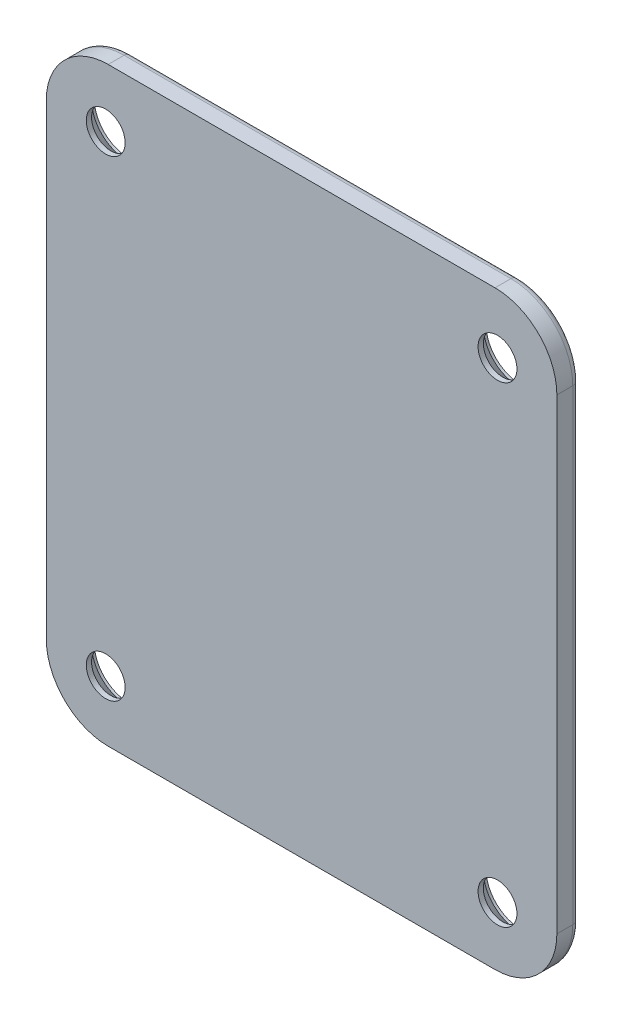
ISO-10303-21;
HEADER;
FILE_DESCRIPTION(('STEP AP214'),'2;1');
FILE_NAME('part.step','',(''),(''),'','','');
FILE_SCHEMA(('AUTOMOTIVE_DESIGN { 1 0 10303 214 1 1 1 1 }'));
ENDSEC;
DATA;
#1=APPLICATION_CONTEXT('core data for automotive mechanical design processes');
#2=APPLICATION_PROTOCOL_DEFINITION('international standard','automotive_design',2000,#1);
#3=PRODUCT_CONTEXT('',#1,'mechanical');
#4=PRODUCT('Part','Part','',(#3));
#5=PRODUCT_RELATED_PRODUCT_CATEGORY('part','',(#4));
#6=PRODUCT_DEFINITION_FORMATION('','',#4);
#7=PRODUCT_DEFINITION_CONTEXT('part definition',#1,'design');
#8=PRODUCT_DEFINITION('design','',#6,#7);
#9=PRODUCT_DEFINITION_SHAPE('','',#8);
#10=(LENGTH_UNIT() NAMED_UNIT(*) SI_UNIT(.MILLI.,.METRE.));
#11=(NAMED_UNIT(*) PLANE_ANGLE_UNIT() SI_UNIT($,.RADIAN.));
#12=(NAMED_UNIT(*) SI_UNIT($,.STERADIAN.) SOLID_ANGLE_UNIT());
#13=UNCERTAINTY_MEASURE_WITH_UNIT(LENGTH_MEASURE(1.E-05),#10,'distance_accuracy_value','');
#14=(GEOMETRIC_REPRESENTATION_CONTEXT(3) GLOBAL_UNCERTAINTY_ASSIGNED_CONTEXT((#13)) GLOBAL_UNIT_ASSIGNED_CONTEXT((#10,
#11,#12)) REPRESENTATION_CONTEXT('',''));
#15=CARTESIAN_POINT('',(0.,0.,0.));
#16=DIRECTION('',(0.,0.,1.));
#17=DIRECTION('',(1.,0.,0.));
#18=AXIS2_PLACEMENT_3D('',#15,#16,#17);
#19=CARTESIAN_POINT('',(11.085,13.345,0.15));
#20=DIRECTION('',(0.,0.,-1.));
#21=DIRECTION('',(1.,0.,0.));
#22=AXIS2_PLACEMENT_3D('',#19,#20,#21);
#23=CONICAL_SURFACE('',#22,1.95,0.785398163397);
#24=DIRECTION('',(-0.707106781186547,0.,0.707106781186547));
#25=VECTOR('',#24,1.);
#26=CARTESIAN_POINT('',(12.61,13.345,0.575));
#27=LINE('',#26,#25);
#28=CARTESIAN_POINT('',(13.035,13.345,0.15));
#29=VERTEX_POINT('',#28);
#30=CARTESIAN_POINT('',(12.185,13.345,1.));
#31=VERTEX_POINT('',#30);
#32=EDGE_CURVE('E9',#29,#31,#27,.T.);
#33=ORIENTED_EDGE('',*,*,#32,.T.);
#34=CARTESIAN_POINT('',(11.085,13.345,1.));
#35=DIRECTION('',(0.,0.,1.));
#36=DIRECTION('',(1.,0.,0.));
#37=AXIS2_PLACEMENT_3D('',#34,#35,#36);
#38=CIRCLE('',#37,1.1);
#39=EDGE_CURVE('E324',#31,#31,#38,.T.);
#40=ORIENTED_EDGE('',*,*,#39,.T.);
#41=ORIENTED_EDGE('',*,*,#32,.F.);
#42=CARTESIAN_POINT('',(11.085,13.345,0.15));
#43=DIRECTION('',(0.,0.,1.));
#44=DIRECTION('',(1.,0.,0.));
#45=AXIS2_PLACEMENT_3D('',#42,#43,#44);
#46=CIRCLE('',#45,1.95);
#47=EDGE_CURVE('E257',#29,#29,#46,.T.);
#48=ORIENTED_EDGE('',*,*,#47,.F.);
#49=EDGE_LOOP('',(#33,#40,#41,#48));
#50=FACE_BOUND('',#49,.T.);
#51=ADVANCED_FACE('F15',(#50),#23,.F.);
#52=CARTESIAN_POINT('',(-11.085,13.345,0.15));
#53=DIRECTION('',(0.,0.,-1.));
#54=DIRECTION('',(1.,0.,0.));
#55=AXIS2_PLACEMENT_3D('',#52,#53,#54);
#56=CONICAL_SURFACE('',#55,1.95,0.785398163397);
#57=DIRECTION('',(-0.707106781186547,0.,0.707106781186547));
#58=VECTOR('',#57,1.);
#59=CARTESIAN_POINT('',(-9.56,13.345,0.575));
#60=LINE('',#59,#58);
#61=CARTESIAN_POINT('',(-9.135,13.345,0.15));
#62=VERTEX_POINT('',#61);
#63=CARTESIAN_POINT('',(-9.985,13.345,1.));
#64=VERTEX_POINT('',#63);
#65=EDGE_CURVE('E26',#62,#64,#60,.T.);
#66=ORIENTED_EDGE('',*,*,#65,.T.);
#67=CARTESIAN_POINT('',(-11.085,13.345,1.));
#68=DIRECTION('',(0.,0.,1.));
#69=DIRECTION('',(1.,0.,0.));
#70=AXIS2_PLACEMENT_3D('',#67,#68,#69);
#71=CIRCLE('',#70,1.1);
#72=EDGE_CURVE('E273',#64,#64,#71,.T.);
#73=ORIENTED_EDGE('',*,*,#72,.T.);
#74=ORIENTED_EDGE('',*,*,#65,.F.);
#75=CARTESIAN_POINT('',(-11.085,13.345,0.15));
#76=DIRECTION('',(0.,0.,1.));
#77=DIRECTION('',(1.,0.,0.));
#78=AXIS2_PLACEMENT_3D('',#75,#76,#77);
#79=CIRCLE('',#78,1.95);
#80=EDGE_CURVE('E258',#62,#62,#79,.T.);
#81=ORIENTED_EDGE('',*,*,#80,.F.);
#82=EDGE_LOOP('',(#66,#73,#74,#81));
#83=FACE_BOUND('',#82,.T.);
#84=ADVANCED_FACE('F499',(#83),#56,.F.);
#85=CARTESIAN_POINT('',(11.085,-13.345,0.15));
#86=DIRECTION('',(0.,0.,-1.));
#87=DIRECTION('',(1.,0.,0.));
#88=AXIS2_PLACEMENT_3D('',#85,#86,#87);
#89=CONICAL_SURFACE('',#88,1.95,0.785398163397);
#90=DIRECTION('',(-0.707106781186547,0.,0.707106781186547));
#91=VECTOR('',#90,1.);
#92=CARTESIAN_POINT('',(12.61,-13.345,0.575));
#93=LINE('',#92,#91);
#94=CARTESIAN_POINT('',(13.035,-13.345,0.15));
#95=VERTEX_POINT('',#94);
#96=CARTESIAN_POINT('',(12.185,-13.345,1.));
#97=VERTEX_POINT('',#96);
#98=EDGE_CURVE('E340',#95,#97,#93,.T.);
#99=ORIENTED_EDGE('',*,*,#98,.T.);
#100=CARTESIAN_POINT('',(11.085,-13.345,1.));
#101=DIRECTION('',(0.,0.,1.));
#102=DIRECTION('',(1.,0.,0.));
#103=AXIS2_PLACEMENT_3D('',#100,#101,#102);
#104=CIRCLE('',#103,1.1);
#105=EDGE_CURVE('E274',#97,#97,#104,.T.);
#106=ORIENTED_EDGE('',*,*,#105,.T.);
#107=ORIENTED_EDGE('',*,*,#98,.F.);
#108=CARTESIAN_POINT('',(11.085,-13.345,0.15));
#109=DIRECTION('',(0.,0.,1.));
#110=DIRECTION('',(1.,0.,0.));
#111=AXIS2_PLACEMENT_3D('',#108,#109,#110);
#112=CIRCLE('',#111,1.95);
#113=EDGE_CURVE('E318',#95,#95,#112,.T.);
#114=ORIENTED_EDGE('',*,*,#113,.F.);
#115=EDGE_LOOP('',(#99,#106,#107,#114));
#116=FACE_BOUND('',#115,.T.);
#117=ADVANCED_FACE('F504',(#116),#89,.F.);
#118=CARTESIAN_POINT('',(-11.085,-13.345,0.15));
#119=DIRECTION('',(0.,0.,-1.));
#120=DIRECTION('',(1.,0.,0.));
#121=AXIS2_PLACEMENT_3D('',#118,#119,#120);
#122=CONICAL_SURFACE('',#121,1.95,0.785398163397);
#123=DIRECTION('',(-0.707106781186547,0.,0.707106781186547));
#124=VECTOR('',#123,1.);
#125=CARTESIAN_POINT('',(-9.56,-13.345,0.575));
#126=LINE('',#125,#124);
#127=CARTESIAN_POINT('',(-9.135,-13.345,0.15));
#128=VERTEX_POINT('',#127);
#129=CARTESIAN_POINT('',(-9.985,-13.345,1.));
#130=VERTEX_POINT('',#129);
#131=EDGE_CURVE('E19',#128,#130,#126,.T.);
#132=ORIENTED_EDGE('',*,*,#131,.T.);
#133=CARTESIAN_POINT('',(-11.085,-13.345,1.));
#134=DIRECTION('',(0.,0.,1.));
#135=DIRECTION('',(1.,0.,0.));
#136=AXIS2_PLACEMENT_3D('',#133,#134,#135);
#137=CIRCLE('',#136,1.1);
#138=EDGE_CURVE('E333',#130,#130,#137,.T.);
#139=ORIENTED_EDGE('',*,*,#138,.T.);
#140=ORIENTED_EDGE('',*,*,#131,.F.);
#141=CARTESIAN_POINT('',(-11.085,-13.345,0.15));
#142=DIRECTION('',(0.,0.,1.));
#143=DIRECTION('',(1.,0.,0.));
#144=AXIS2_PLACEMENT_3D('',#141,#142,#143);
#145=CIRCLE('',#144,1.95);
#146=EDGE_CURVE('E332',#128,#128,#145,.T.);
#147=ORIENTED_EDGE('',*,*,#146,.F.);
#148=EDGE_LOOP('',(#132,#139,#140,#147));
#149=FACE_BOUND('',#148,.T.);
#150=ADVANCED_FACE('F577',(#149),#122,.F.);
#151=CARTESIAN_POINT('',(11.085,13.345,0.));
#152=DIRECTION('',(0.,0.,-1.));
#153=DIRECTION('',(1.,0.,0.));
#154=AXIS2_PLACEMENT_3D('',#151,#152,#153);
#155=CYLINDRICAL_SURFACE('',#154,1.95);
#156=DIRECTION('',(0.,0.,1.));
#157=VECTOR('',#156,1.);
#158=CARTESIAN_POINT('',(13.035,13.345,0.));
#159=LINE('',#158,#157);
#160=CARTESIAN_POINT('',(13.035,13.345,0.));
#161=VERTEX_POINT('',#160);
#162=EDGE_CURVE('E253',#161,#29,#159,.T.);
#163=ORIENTED_EDGE('',*,*,#162,.T.);
#164=ORIENTED_EDGE('',*,*,#47,.T.);
#165=ORIENTED_EDGE('',*,*,#162,.F.);
#166=CARTESIAN_POINT('',(11.085,13.345,0.));
#167=DIRECTION('',(0.,0.,1.));
#168=DIRECTION('',(1.,0.,0.));
#169=AXIS2_PLACEMENT_3D('',#166,#167,#168);
#170=CIRCLE('',#169,1.95);
#171=EDGE_CURVE('E302',#161,#161,#170,.T.);
#172=ORIENTED_EDGE('',*,*,#171,.F.);
#173=EDGE_LOOP('',(#163,#164,#165,#172));
#174=FACE_BOUND('',#173,.T.);
#175=ADVANCED_FACE('F584',(#174),#155,.F.);
#176=CARTESIAN_POINT('',(-11.085,13.345,0.));
#177=DIRECTION('',(0.,0.,-1.));
#178=DIRECTION('',(1.,0.,0.));
#179=AXIS2_PLACEMENT_3D('',#176,#177,#178);
#180=CYLINDRICAL_SURFACE('',#179,1.95);
#181=DIRECTION('',(0.,0.,1.));
#182=VECTOR('',#181,1.);
#183=CARTESIAN_POINT('',(-9.135,13.345,0.));
#184=LINE('',#183,#182);
#185=CARTESIAN_POINT('',(-9.135,13.345,0.));
#186=VERTEX_POINT('',#185);
#187=EDGE_CURVE('E322',#186,#62,#184,.T.);
#188=ORIENTED_EDGE('',*,*,#187,.T.);
#189=ORIENTED_EDGE('',*,*,#80,.T.);
#190=ORIENTED_EDGE('',*,*,#187,.F.);
#191=CARTESIAN_POINT('',(-11.085,13.345,0.));
#192=DIRECTION('',(0.,0.,1.));
#193=DIRECTION('',(1.,0.,0.));
#194=AXIS2_PLACEMENT_3D('',#191,#192,#193);
#195=CIRCLE('',#194,1.95);
#196=EDGE_CURVE('E298',#186,#186,#195,.T.);
#197=ORIENTED_EDGE('',*,*,#196,.F.);
#198=EDGE_LOOP('',(#188,#189,#190,#197));
#199=FACE_BOUND('',#198,.T.);
#200=ADVANCED_FACE('F580',(#199),#180,.F.);
#201=CARTESIAN_POINT('',(11.085,-13.345,0.));
#202=DIRECTION('',(0.,0.,-1.));
#203=DIRECTION('',(1.,0.,0.));
#204=AXIS2_PLACEMENT_3D('',#201,#202,#203);
#205=CYLINDRICAL_SURFACE('',#204,1.95);
#206=DIRECTION('',(0.,0.,1.));
#207=VECTOR('',#206,1.);
#208=CARTESIAN_POINT('',(13.035,-13.345,0.));
#209=LINE('',#208,#207);
#210=CARTESIAN_POINT('',(13.035,-13.345,0.));
#211=VERTEX_POINT('',#210);
#212=EDGE_CURVE('E323',#211,#95,#209,.T.);
#213=ORIENTED_EDGE('',*,*,#212,.T.);
#214=ORIENTED_EDGE('',*,*,#113,.T.);
#215=ORIENTED_EDGE('',*,*,#212,.F.);
#216=CARTESIAN_POINT('',(11.085,-13.345,0.));
#217=DIRECTION('',(0.,0.,1.));
#218=DIRECTION('',(1.,0.,0.));
#219=AXIS2_PLACEMENT_3D('',#216,#217,#218);
#220=CIRCLE('',#219,1.95);
#221=EDGE_CURVE('E284',#211,#211,#220,.T.);
#222=ORIENTED_EDGE('',*,*,#221,.F.);
#223=EDGE_LOOP('',(#213,#214,#215,#222));
#224=FACE_BOUND('',#223,.T.);
#225=ADVANCED_FACE('F583',(#224),#205,.F.);
#226=CARTESIAN_POINT('',(-11.085,-13.345,0.));
#227=DIRECTION('',(0.,0.,-1.));
#228=DIRECTION('',(1.,0.,0.));
#229=AXIS2_PLACEMENT_3D('',#226,#227,#228);
#230=CYLINDRICAL_SURFACE('',#229,1.95);
#231=DIRECTION('',(0.,0.,1.));
#232=VECTOR('',#231,1.);
#233=CARTESIAN_POINT('',(-9.135,-13.345,0.));
#234=LINE('',#233,#232);
#235=CARTESIAN_POINT('',(-9.135,-13.345,0.));
#236=VERTEX_POINT('',#235);
#237=EDGE_CURVE('E248',#236,#128,#234,.T.);
#238=ORIENTED_EDGE('',*,*,#237,.T.);
#239=ORIENTED_EDGE('',*,*,#146,.T.);
#240=ORIENTED_EDGE('',*,*,#237,.F.);
#241=CARTESIAN_POINT('',(-11.085,-13.345,0.));
#242=DIRECTION('',(0.,0.,1.));
#243=DIRECTION('',(1.,0.,0.));
#244=AXIS2_PLACEMENT_3D('',#241,#242,#243);
#245=CIRCLE('',#244,1.95);
#246=EDGE_CURVE('E280',#236,#236,#245,.T.);
#247=ORIENTED_EDGE('',*,*,#246,.F.);
#248=EDGE_LOOP('',(#238,#239,#240,#247));
#249=FACE_BOUND('',#248,.T.);
#250=ADVANCED_FACE('F479',(#249),#230,.F.);
#251=CARTESIAN_POINT('',(14.045,13.205,0.4));
#252=DIRECTION('',(0.,-1.,0.));
#253=DIRECTION('',(1.,0.,0.));
#254=AXIS2_PLACEMENT_3D('',#251,#252,#253);
#255=CYLINDRICAL_SURFACE('',#254,0.4);
#256=DIRECTION('',(0.,-1.,0.));
#257=VECTOR('',#256,1.);
#258=CARTESIAN_POINT('',(14.445,13.205,0.4));
#259=LINE('',#258,#257);
#260=CARTESIAN_POINT('',(14.445,13.205,0.4));
#261=VERTEX_POINT('',#260);
#262=CARTESIAN_POINT('',(14.445,-13.205,0.4));
#263=VERTEX_POINT('',#262);
#264=EDGE_CURVE('E337',#261,#263,#259,.T.);
#265=ORIENTED_EDGE('',*,*,#264,.T.);
#266=CARTESIAN_POINT('',(14.045,-13.205,0.4));
#267=DIRECTION('',(0.,1.,0.));
#268=DIRECTION('',(1.,0.,0.));
#269=AXIS2_PLACEMENT_3D('',#266,#267,#268);
#270=CIRCLE('',#269,0.4);
#271=CARTESIAN_POINT('',(14.045,-13.205,0.));
#272=VERTEX_POINT('',#271);
#273=EDGE_CURVE('E278',#263,#272,#270,.T.);
#274=ORIENTED_EDGE('',*,*,#273,.T.);
#275=DIRECTION('',(0.,-1.,0.));
#276=VECTOR('',#275,1.);
#277=CARTESIAN_POINT('',(14.045,13.205,0.));
#278=LINE('',#277,#276);
#279=CARTESIAN_POINT('',(14.045,13.205,0.));
#280=VERTEX_POINT('',#279);
#281=EDGE_CURVE('E382',#280,#272,#278,.T.);
#282=ORIENTED_EDGE('',*,*,#281,.F.);
#283=CARTESIAN_POINT('',(14.045,13.205,0.4));
#284=DIRECTION('',(0.,1.,0.));
#285=DIRECTION('',(1.,0.,0.));
#286=AXIS2_PLACEMENT_3D('',#283,#284,#285);
#287=CIRCLE('',#286,0.4);
#288=EDGE_CURVE('E310',#261,#280,#287,.T.);
#289=ORIENTED_EDGE('',*,*,#288,.F.);
#290=EDGE_LOOP('',(#265,#274,#282,#289));
#291=FACE_BOUND('',#290,.T.);
#292=ADVANCED_FACE('F594',(#291),#255,.T.);
#293=CARTESIAN_POINT('',(10.945,13.205,0.4));
#294=DIRECTION('',(0.,0.,-1.));
#295=DIRECTION('',(0.,1.,0.));
#296=AXIS2_PLACEMENT_3D('',#293,#294,#295);
#297=TOROIDAL_SURFACE('',#296,3.1,0.4);
#298=CARTESIAN_POINT('',(10.945,16.305,0.4));
#299=DIRECTION('',(-1.,0.,0.));
#300=DIRECTION('',(0.,1.,0.));
#301=AXIS2_PLACEMENT_3D('',#298,#299,#300);
#302=CIRCLE('',#301,0.4);
#303=CARTESIAN_POINT('',(10.945,16.705,0.4));
#304=VERTEX_POINT('',#303);
#305=CARTESIAN_POINT('',(10.945,16.305,0.));
#306=VERTEX_POINT('',#305);
#307=EDGE_CURVE('E275',#304,#306,#302,.T.);
#308=ORIENTED_EDGE('',*,*,#307,.F.);
#309=CARTESIAN_POINT('',(10.945,13.205,0.4));
#310=DIRECTION('',(0.,0.,-1.));
#311=DIRECTION('',(0.,1.,0.));
#312=AXIS2_PLACEMENT_3D('',#309,#310,#311);
#313=CIRCLE('',#312,3.5);
#314=EDGE_CURVE('E306',#304,#261,#313,.T.);
#315=ORIENTED_EDGE('',*,*,#314,.T.);
#316=ORIENTED_EDGE('',*,*,#288,.T.);
#317=CARTESIAN_POINT('',(10.945,13.205,0.));
#318=DIRECTION('',(0.,0.,-1.));
#319=DIRECTION('',(0.,1.,0.));
#320=AXIS2_PLACEMENT_3D('',#317,#318,#319);
#321=CIRCLE('',#320,3.1);
#322=EDGE_CURVE('E378',#306,#280,#321,.T.);
#323=ORIENTED_EDGE('',*,*,#322,.F.);
#324=EDGE_LOOP('',(#308,#315,#316,#323));
#325=FACE_BOUND('',#324,.T.);
#326=ADVANCED_FACE('F597',(#325),#297,.T.);
#327=CARTESIAN_POINT('',(10.945,-13.205,0.4));
#328=DIRECTION('',(0.,0.,-1.));
#329=DIRECTION('',(1.,0.,0.));
#330=AXIS2_PLACEMENT_3D('',#327,#328,#329);
#331=TOROIDAL_SURFACE('',#330,3.1,0.4);
#332=ORIENTED_EDGE('',*,*,#273,.F.);
#333=CARTESIAN_POINT('',(10.945,-13.205,0.4));
#334=DIRECTION('',(0.,0.,-1.));
#335=DIRECTION('',(1.,0.,0.));
#336=AXIS2_PLACEMENT_3D('',#333,#334,#335);
#337=CIRCLE('',#336,3.5);
#338=CARTESIAN_POINT('',(10.945,-16.705,0.4));
#339=VERTEX_POINT('',#338);
#340=EDGE_CURVE('E401',#263,#339,#337,.T.);
#341=ORIENTED_EDGE('',*,*,#340,.T.);
#342=CARTESIAN_POINT('',(10.945,-16.305,0.4));
#343=DIRECTION('',(1.,0.,0.));
#344=DIRECTION('',(0.,-1.,0.));
#345=AXIS2_PLACEMENT_3D('',#342,#343,#344);
#346=CIRCLE('',#345,0.4);
#347=CARTESIAN_POINT('',(10.945,-16.305,0.));
#348=VERTEX_POINT('',#347);
#349=EDGE_CURVE('E279',#339,#348,#346,.T.);
#350=ORIENTED_EDGE('',*,*,#349,.T.);
#351=CARTESIAN_POINT('',(10.945,-13.205,0.));
#352=DIRECTION('',(0.,0.,-1.));
#353=DIRECTION('',(1.,0.,0.));
#354=AXIS2_PLACEMENT_3D('',#351,#352,#353);
#355=CIRCLE('',#354,3.1);
#356=EDGE_CURVE('E379',#272,#348,#355,.T.);
#357=ORIENTED_EDGE('',*,*,#356,.F.);
#358=EDGE_LOOP('',(#332,#341,#350,#357));
#359=FACE_BOUND('',#358,.T.);
#360=ADVANCED_FACE('F599',(#359),#331,.T.);
#361=CARTESIAN_POINT('',(-10.945,16.305,0.4));
#362=DIRECTION('',(1.,0.,0.));
#363=DIRECTION('',(0.,1.,0.));
#364=AXIS2_PLACEMENT_3D('',#361,#362,#363);
#365=CYLINDRICAL_SURFACE('',#364,0.4);
#366=DIRECTION('',(1.,0.,0.));
#367=VECTOR('',#366,1.);
#368=CARTESIAN_POINT('',(-10.945,16.705,0.4));
#369=LINE('',#368,#367);
#370=CARTESIAN_POINT('',(-10.945,16.705,0.4));
#371=VERTEX_POINT('',#370);
#372=EDGE_CURVE('E367',#371,#304,#369,.T.);
#373=ORIENTED_EDGE('',*,*,#372,.T.);
#374=ORIENTED_EDGE('',*,*,#307,.T.);
#375=DIRECTION('',(1.,0.,0.));
#376=VECTOR('',#375,1.);
#377=CARTESIAN_POINT('',(-10.945,16.305,0.));
#378=LINE('',#377,#376);
#379=CARTESIAN_POINT('',(-10.945,16.305,0.));
#380=VERTEX_POINT('',#379);
#381=EDGE_CURVE('E223',#380,#306,#378,.T.);
#382=ORIENTED_EDGE('',*,*,#381,.F.);
#383=CARTESIAN_POINT('',(-10.945,16.305,0.4));
#384=DIRECTION('',(-1.,0.,0.));
#385=DIRECTION('',(0.,1.,0.));
#386=AXIS2_PLACEMENT_3D('',#383,#384,#385);
#387=CIRCLE('',#386,0.4);
#388=EDGE_CURVE('E218',#371,#380,#387,.T.);
#389=ORIENTED_EDGE('',*,*,#388,.F.);
#390=EDGE_LOOP('',(#373,#374,#382,#389));
#391=FACE_BOUND('',#390,.T.);
#392=ADVANCED_FACE('F507',(#391),#365,.T.);
#393=CARTESIAN_POINT('',(10.945,-16.305,0.4));
#394=DIRECTION('',(-1.,0.,0.));
#395=DIRECTION('',(0.,-1.,0.));
#396=AXIS2_PLACEMENT_3D('',#393,#394,#395);
#397=CYLINDRICAL_SURFACE('',#396,0.4);
#398=DIRECTION('',(-1.,0.,0.));
#399=VECTOR('',#398,1.);
#400=CARTESIAN_POINT('',(10.945,-16.705,0.4));
#401=LINE('',#400,#399);
#402=CARTESIAN_POINT('',(-10.945,-16.705,0.4));
#403=VERTEX_POINT('',#402);
#404=EDGE_CURVE('E365',#339,#403,#401,.T.);
#405=ORIENTED_EDGE('',*,*,#404,.T.);
#406=CARTESIAN_POINT('',(-10.945,-16.305,0.4));
#407=DIRECTION('',(1.,0.,0.));
#408=DIRECTION('',(0.,-1.,0.));
#409=AXIS2_PLACEMENT_3D('',#406,#407,#408);
#410=CIRCLE('',#409,0.4);
#411=CARTESIAN_POINT('',(-10.945,-16.305,0.));
#412=VERTEX_POINT('',#411);
#413=EDGE_CURVE('E250',#403,#412,#410,.T.);
#414=ORIENTED_EDGE('',*,*,#413,.T.);
#415=DIRECTION('',(-1.,0.,0.));
#416=VECTOR('',#415,1.);
#417=CARTESIAN_POINT('',(10.945,-16.305,0.));
#418=LINE('',#417,#416);
#419=EDGE_CURVE('E285',#348,#412,#418,.T.);
#420=ORIENTED_EDGE('',*,*,#419,.F.);
#421=ORIENTED_EDGE('',*,*,#349,.F.);
#422=EDGE_LOOP('',(#405,#414,#420,#421));
#423=FACE_BOUND('',#422,.T.);
#424=ADVANCED_FACE('F511',(#423),#397,.T.);
#425=CARTESIAN_POINT('',(11.085,13.345,1.));
#426=DIRECTION('',(0.,0.,-1.));
#427=DIRECTION('',(1.,0.,0.));
#428=AXIS2_PLACEMENT_3D('',#425,#426,#427);
#429=CYLINDRICAL_SURFACE('',#428,1.1);
#430=ORIENTED_EDGE('',*,*,#39,.F.);
#431=DIRECTION('',(0.,0.,1.));
#432=VECTOR('',#431,1.);
#433=CARTESIAN_POINT('',(12.185,13.345,1.));
#434=LINE('',#433,#432);
#435=CARTESIAN_POINT('',(12.185,13.345,1.3));
#436=VERTEX_POINT('',#435);
#437=EDGE_CURVE('E327',#31,#436,#434,.T.);
#438=ORIENTED_EDGE('',*,*,#437,.T.);
#439=CARTESIAN_POINT('',(11.085,13.345,1.3));
#440=DIRECTION('',(0.,0.,-1.));
#441=DIRECTION('',(1.,0.,0.));
#442=AXIS2_PLACEMENT_3D('',#439,#440,#441);
#443=CIRCLE('',#442,1.1);
#444=EDGE_CURVE('E290',#436,#436,#443,.T.);
#445=ORIENTED_EDGE('',*,*,#444,.F.);
#446=ORIENTED_EDGE('',*,*,#437,.F.);
#447=EDGE_LOOP('',(#430,#438,#445,#446));
#448=FACE_BOUND('',#447,.T.);
#449=ADVANCED_FACE('F508',(#448),#429,.F.);
#450=CARTESIAN_POINT('',(-11.085,13.345,1.));
#451=DIRECTION('',(0.,0.,-1.));
#452=DIRECTION('',(1.,0.,0.));
#453=AXIS2_PLACEMENT_3D('',#450,#451,#452);
#454=CYLINDRICAL_SURFACE('',#453,1.1);
#455=ORIENTED_EDGE('',*,*,#72,.F.);
#456=DIRECTION('',(0.,0.,1.));
#457=VECTOR('',#456,1.);
#458=CARTESIAN_POINT('',(-9.985,13.345,1.));
#459=LINE('',#458,#457);
#460=CARTESIAN_POINT('',(-9.985,13.345,1.3));
#461=VERTEX_POINT('',#460);
#462=EDGE_CURVE('E328',#64,#461,#459,.T.);
#463=ORIENTED_EDGE('',*,*,#462,.T.);
#464=CARTESIAN_POINT('',(-11.085,13.345,1.3));
#465=DIRECTION('',(0.,0.,-1.));
#466=DIRECTION('',(1.,0.,0.));
#467=AXIS2_PLACEMENT_3D('',#464,#465,#466);
#468=CIRCLE('',#467,1.1);
#469=EDGE_CURVE('E289',#461,#461,#468,.T.);
#470=ORIENTED_EDGE('',*,*,#469,.F.);
#471=ORIENTED_EDGE('',*,*,#462,.F.);
#472=EDGE_LOOP('',(#455,#463,#470,#471));
#473=FACE_BOUND('',#472,.T.);
#474=ADVANCED_FACE('F510',(#473),#454,.F.);
#475=CARTESIAN_POINT('',(11.085,-13.345,1.));
#476=DIRECTION('',(0.,0.,-1.));
#477=DIRECTION('',(1.,0.,0.));
#478=AXIS2_PLACEMENT_3D('',#475,#476,#477);
#479=CYLINDRICAL_SURFACE('',#478,1.1);
#480=ORIENTED_EDGE('',*,*,#105,.F.);
#481=DIRECTION('',(0.,0.,1.));
#482=VECTOR('',#481,1.);
#483=CARTESIAN_POINT('',(12.185,-13.345,1.));
#484=LINE('',#483,#482);
#485=CARTESIAN_POINT('',(12.185,-13.345,1.3));
#486=VERTEX_POINT('',#485);
#487=EDGE_CURVE('E270',#97,#486,#484,.T.);
#488=ORIENTED_EDGE('',*,*,#487,.T.);
#489=CARTESIAN_POINT('',(11.085,-13.345,1.3));
#490=DIRECTION('',(0.,0.,-1.));
#491=DIRECTION('',(1.,0.,0.));
#492=AXIS2_PLACEMENT_3D('',#489,#490,#491);
#493=CIRCLE('',#492,1.1);
#494=EDGE_CURVE('E263',#486,#486,#493,.T.);
#495=ORIENTED_EDGE('',*,*,#494,.F.);
#496=ORIENTED_EDGE('',*,*,#487,.F.);
#497=EDGE_LOOP('',(#480,#488,#495,#496));
#498=FACE_BOUND('',#497,.T.);
#499=ADVANCED_FACE('F517',(#498),#479,.F.);
#500=CARTESIAN_POINT('',(-11.085,-13.345,1.));
#501=DIRECTION('',(0.,0.,-1.));
#502=DIRECTION('',(1.,0.,0.));
#503=AXIS2_PLACEMENT_3D('',#500,#501,#502);
#504=CYLINDRICAL_SURFACE('',#503,1.1);
#505=ORIENTED_EDGE('',*,*,#138,.F.);
#506=DIRECTION('',(0.,0.,1.));
#507=VECTOR('',#506,1.);
#508=CARTESIAN_POINT('',(-9.985,-13.345,1.));
#509=LINE('',#508,#507);
#510=CARTESIAN_POINT('',(-9.985,-13.345,1.3));
#511=VERTEX_POINT('',#510);
#512=EDGE_CURVE('E336',#130,#511,#509,.T.);
#513=ORIENTED_EDGE('',*,*,#512,.T.);
#514=CARTESIAN_POINT('',(-11.085,-13.345,1.3));
#515=DIRECTION('',(0.,0.,-1.));
#516=DIRECTION('',(1.,0.,0.));
#517=AXIS2_PLACEMENT_3D('',#514,#515,#516);
#518=CIRCLE('',#517,1.1);
#519=EDGE_CURVE('E259',#511,#511,#518,.T.);
#520=ORIENTED_EDGE('',*,*,#519,.F.);
#521=ORIENTED_EDGE('',*,*,#512,.F.);
#522=EDGE_LOOP('',(#505,#513,#520,#521));
#523=FACE_BOUND('',#522,.T.);
#524=ADVANCED_FACE('F654',(#523),#504,.F.);
#525=CARTESIAN_POINT('',(14.445,-16.705,0.));
#526=DIRECTION('',(1.,0.,0.));
#527=DIRECTION('',(0.,1.,0.));
#528=AXIS2_PLACEMENT_3D('',#525,#526,#527);
#529=PLANE('',#528);
#530=DIRECTION('',(0.,0.,1.));
#531=VECTOR('',#530,1.);
#532=CARTESIAN_POINT('',(14.445,-13.205,0.));
#533=LINE('',#532,#531);
#534=CARTESIAN_POINT('',(14.445,-13.205,1.3));
#535=VERTEX_POINT('',#534);
#536=EDGE_CURVE('E307',#263,#535,#533,.T.);
#537=ORIENTED_EDGE('',*,*,#536,.F.);
#538=ORIENTED_EDGE('',*,*,#264,.F.);
#539=DIRECTION('',(0.,0.,1.));
#540=VECTOR('',#539,1.);
#541=CARTESIAN_POINT('',(14.445,13.205,0.));
#542=LINE('',#541,#540);
#543=CARTESIAN_POINT('',(14.445,13.205,1.3));
#544=VERTEX_POINT('',#543);
#545=EDGE_CURVE('E303',#261,#544,#542,.T.);
#546=ORIENTED_EDGE('',*,*,#545,.T.);
#547=DIRECTION('',(0.,1.,0.));
#548=VECTOR('',#547,1.);
#549=CARTESIAN_POINT('',(14.445,-16.705,1.3));
#550=LINE('',#549,#548);
#551=EDGE_CURVE('E432',#535,#544,#550,.T.);
#552=ORIENTED_EDGE('',*,*,#551,.F.);
#553=EDGE_LOOP('',(#537,#538,#546,#552));
#554=FACE_BOUND('',#553,.T.);
#555=ADVANCED_FACE('F552',(#554),#529,.T.);
#556=CARTESIAN_POINT('',(10.945,13.205,0.));
#557=DIRECTION('',(0.,0.,1.));
#558=DIRECTION('',(1.,0.,0.));
#559=AXIS2_PLACEMENT_3D('',#556,#557,#558);
#560=CYLINDRICAL_SURFACE('',#559,3.5);
#561=ORIENTED_EDGE('',*,*,#545,.F.);
#562=ORIENTED_EDGE('',*,*,#314,.F.);
#563=DIRECTION('',(0.,0.,1.));
#564=VECTOR('',#563,1.);
#565=CARTESIAN_POINT('',(10.945,16.705,0.));
#566=LINE('',#565,#564);
#567=CARTESIAN_POINT('',(10.945,16.705,1.3));
#568=VERTEX_POINT('',#567);
#569=EDGE_CURVE('E301',#304,#568,#566,.T.);
#570=ORIENTED_EDGE('',*,*,#569,.T.);
#571=CARTESIAN_POINT('',(10.945,13.205,1.3));
#572=DIRECTION('',(0.,0.,1.));
#573=DIRECTION('',(0.,-1.,0.));
#574=AXIS2_PLACEMENT_3D('',#571,#572,#573);
#575=CIRCLE('',#574,3.5);
#576=EDGE_CURVE('E428',#544,#568,#575,.T.);
#577=ORIENTED_EDGE('',*,*,#576,.F.);
#578=EDGE_LOOP('',(#561,#562,#570,#577));
#579=FACE_BOUND('',#578,.T.);
#580=ADVANCED_FACE('F555',(#579),#560,.T.);
#581=CARTESIAN_POINT('',(10.945,-13.205,0.));
#582=DIRECTION('',(0.,0.,1.));
#583=DIRECTION('',(1.,0.,0.));
#584=AXIS2_PLACEMENT_3D('',#581,#582,#583);
#585=CYLINDRICAL_SURFACE('',#584,3.5);
#586=CARTESIAN_POINT('',(10.945,-13.205,1.3));
#587=DIRECTION('',(0.,0.,-1.));
#588=DIRECTION('',(0.,-1.,0.));
#589=AXIS2_PLACEMENT_3D('',#586,#587,#588);
#590=CIRCLE('',#589,3.5);
#591=CARTESIAN_POINT('',(10.945,-16.705,1.3));
#592=VERTEX_POINT('',#591);
#593=EDGE_CURVE('E373',#535,#592,#590,.T.);
#594=ORIENTED_EDGE('',*,*,#593,.T.);
#595=DIRECTION('',(0.,0.,1.));
#596=VECTOR('',#595,1.);
#597=CARTESIAN_POINT('',(10.945,-16.705,0.));
#598=LINE('',#597,#596);
#599=EDGE_CURVE('E224',#339,#592,#598,.T.);
#600=ORIENTED_EDGE('',*,*,#599,.F.);
#601=ORIENTED_EDGE('',*,*,#340,.F.);
#602=ORIENTED_EDGE('',*,*,#536,.T.);
#603=EDGE_LOOP('',(#594,#600,#601,#602));
#604=FACE_BOUND('',#603,.T.);
#605=ADVANCED_FACE('F549',(#604),#585,.T.);
#606=CARTESIAN_POINT('',(-14.445,16.705,0.));
#607=DIRECTION('',(0.,1.,0.));
#608=DIRECTION('',(1.,0.,0.));
#609=AXIS2_PLACEMENT_3D('',#606,#607,#608);
#610=PLANE('',#609);
#611=DIRECTION('',(0.,0.,1.));
#612=VECTOR('',#611,1.);
#613=CARTESIAN_POINT('',(-10.945,16.705,0.));
#614=LINE('',#613,#612);
#615=CARTESIAN_POINT('',(-10.945,16.705,1.3));
#616=VERTEX_POINT('',#615);
#617=EDGE_CURVE('E294',#371,#616,#614,.T.);
#618=ORIENTED_EDGE('',*,*,#617,.T.);
#619=DIRECTION('',(1.,0.,0.));
#620=VECTOR('',#619,1.);
#621=CARTESIAN_POINT('',(-14.445,16.705,1.3));
#622=LINE('',#621,#620);
#623=EDGE_CURVE('E411',#616,#568,#622,.T.);
#624=ORIENTED_EDGE('',*,*,#623,.T.);
#625=ORIENTED_EDGE('',*,*,#569,.F.);
#626=ORIENTED_EDGE('',*,*,#372,.F.);
#627=EDGE_LOOP('',(#618,#624,#625,#626));
#628=FACE_BOUND('',#627,.T.);
#629=ADVANCED_FACE('F493',(#628),#610,.T.);
#630=CARTESIAN_POINT('',(-10.945,13.205,0.4));
#631=DIRECTION('',(0.,0.,-1.));
#632=DIRECTION('',(-1.,0.,0.));
#633=AXIS2_PLACEMENT_3D('',#630,#631,#632);
#634=TOROIDAL_SURFACE('',#633,3.1,0.4);
#635=CARTESIAN_POINT('',(-14.045,13.205,0.4));
#636=DIRECTION('',(0.,-1.,0.));
#637=DIRECTION('',(-1.,0.,0.));
#638=AXIS2_PLACEMENT_3D('',#635,#636,#637);
#639=CIRCLE('',#638,0.4);
#640=CARTESIAN_POINT('',(-14.445,13.205,0.4));
#641=VERTEX_POINT('',#640);
#642=CARTESIAN_POINT('',(-14.045,13.205,0.));
#643=VERTEX_POINT('',#642);
#644=EDGE_CURVE('E216',#641,#643,#639,.T.);
#645=ORIENTED_EDGE('',*,*,#644,.F.);
#646=CARTESIAN_POINT('',(-10.945,13.205,0.4));
#647=DIRECTION('',(0.,0.,-1.));
#648=DIRECTION('',(-1.,0.,0.));
#649=AXIS2_PLACEMENT_3D('',#646,#647,#648);
#650=CIRCLE('',#649,3.5);
#651=EDGE_CURVE('E108',#641,#371,#650,.T.);
#652=ORIENTED_EDGE('',*,*,#651,.T.);
#653=ORIENTED_EDGE('',*,*,#388,.T.);
#654=CARTESIAN_POINT('',(-10.945,13.205,0.));
#655=DIRECTION('',(0.,0.,-1.));
#656=DIRECTION('',(-1.,0.,0.));
#657=AXIS2_PLACEMENT_3D('',#654,#655,#656);
#658=CIRCLE('',#657,3.1);
#659=EDGE_CURVE('E212',#643,#380,#658,.T.);
#660=ORIENTED_EDGE('',*,*,#659,.F.);
#661=EDGE_LOOP('',(#645,#652,#653,#660));
#662=FACE_BOUND('',#661,.T.);
#663=ADVANCED_FACE('F214',(#662),#634,.T.);
#664=CARTESIAN_POINT('',(-14.445,-16.705,0.));
#665=DIRECTION('',(0.,0.,1.));
#666=DIRECTION('',(1.,0.,0.));
#667=AXIS2_PLACEMENT_3D('',#664,#665,#666);
#668=PLANE('',#667);
#669=ORIENTED_EDGE('',*,*,#171,.T.);
#670=EDGE_LOOP('',(#669));
#671=FACE_BOUND('',#670,.T.);
#672=ORIENTED_EDGE('',*,*,#196,.T.);
#673=EDGE_LOOP('',(#672));
#674=FACE_BOUND('',#673,.T.);
#675=ORIENTED_EDGE('',*,*,#221,.T.);
#676=EDGE_LOOP('',(#675));
#677=FACE_BOUND('',#676,.T.);
#678=ORIENTED_EDGE('',*,*,#246,.T.);
#679=EDGE_LOOP('',(#678));
#680=FACE_BOUND('',#679,.T.);
#681=ORIENTED_EDGE('',*,*,#659,.T.);
#682=ORIENTED_EDGE('',*,*,#381,.T.);
#683=ORIENTED_EDGE('',*,*,#322,.T.);
#684=ORIENTED_EDGE('',*,*,#281,.T.);
#685=ORIENTED_EDGE('',*,*,#356,.T.);
#686=ORIENTED_EDGE('',*,*,#419,.T.);
#687=CARTESIAN_POINT('',(-10.945,-13.205,0.));
#688=DIRECTION('',(0.,0.,-1.));
#689=DIRECTION('',(0.,-1.,0.));
#690=AXIS2_PLACEMENT_3D('',#687,#688,#689);
#691=CIRCLE('',#690,3.1);
#692=CARTESIAN_POINT('',(-14.045,-13.205,0.));
#693=VERTEX_POINT('',#692);
#694=EDGE_CURVE('E229',#412,#693,#691,.T.);
#695=ORIENTED_EDGE('',*,*,#694,.T.);
#696=DIRECTION('',(0.,1.,0.));
#697=VECTOR('',#696,1.);
#698=CARTESIAN_POINT('',(-14.045,-13.205,0.));
#699=LINE('',#698,#697);
#700=EDGE_CURVE('E226',#693,#643,#699,.T.);
#701=ORIENTED_EDGE('',*,*,#700,.T.);
#702=EDGE_LOOP('',(#681,#682,#683,#684,#685,#686,#695,#701));
#703=FACE_BOUND('',#702,.T.);
#704=ADVANCED_FACE('F227',(#671,#674,#677,#680,#703),#668,.F.);
#705=CARTESIAN_POINT('',(-14.445,-16.705,0.));
#706=DIRECTION('',(0.,1.,0.));
#707=DIRECTION('',(1.,0.,0.));
#708=AXIS2_PLACEMENT_3D('',#705,#706,#707);
#709=PLANE('',#708);
#710=ORIENTED_EDGE('',*,*,#404,.F.);
#711=ORIENTED_EDGE('',*,*,#599,.T.);
#712=DIRECTION('',(1.,0.,0.));
#713=VECTOR('',#712,1.);
#714=CARTESIAN_POINT('',(-14.445,-16.705,1.3));
#715=LINE('',#714,#713);
#716=CARTESIAN_POINT('',(-10.945,-16.705,1.3));
#717=VERTEX_POINT('',#716);
#718=EDGE_CURVE('E369',#717,#592,#715,.T.);
#719=ORIENTED_EDGE('',*,*,#718,.F.);
#720=DIRECTION('',(0.,0.,1.));
#721=VECTOR('',#720,1.);
#722=CARTESIAN_POINT('',(-10.945,-16.705,0.));
#723=LINE('',#722,#721);
#724=EDGE_CURVE('E244',#403,#717,#723,.T.);
#725=ORIENTED_EDGE('',*,*,#724,.F.);
#726=EDGE_LOOP('',(#710,#711,#719,#725));
#727=FACE_BOUND('',#726,.T.);
#728=ADVANCED_FACE('F482',(#727),#709,.F.);
#729=CARTESIAN_POINT('',(-10.945,-13.205,0.4));
#730=DIRECTION('',(0.,0.,-1.));
#731=DIRECTION('',(0.,-1.,0.));
#732=AXIS2_PLACEMENT_3D('',#729,#730,#731);
#733=TOROIDAL_SURFACE('',#732,3.1,0.4);
#734=ORIENTED_EDGE('',*,*,#413,.F.);
#735=CARTESIAN_POINT('',(-10.945,-13.205,0.4));
#736=DIRECTION('',(0.,0.,-1.));
#737=DIRECTION('',(0.,-1.,0.));
#738=AXIS2_PLACEMENT_3D('',#735,#736,#737);
#739=CIRCLE('',#738,3.5);
#740=CARTESIAN_POINT('',(-14.445,-13.205,0.4));
#741=VERTEX_POINT('',#740);
#742=EDGE_CURVE('E314',#403,#741,#739,.T.);
#743=ORIENTED_EDGE('',*,*,#742,.T.);
#744=CARTESIAN_POINT('',(-14.045,-13.205,0.4));
#745=DIRECTION('',(0.,-1.,0.));
#746=DIRECTION('',(-1.,0.,0.));
#747=AXIS2_PLACEMENT_3D('',#744,#745,#746);
#748=CIRCLE('',#747,0.4);
#749=EDGE_CURVE('E92',#741,#693,#748,.T.);
#750=ORIENTED_EDGE('',*,*,#749,.T.);
#751=ORIENTED_EDGE('',*,*,#694,.F.);
#752=EDGE_LOOP('',(#734,#743,#750,#751));
#753=FACE_BOUND('',#752,.T.);
#754=ADVANCED_FACE('F490',(#753),#733,.T.);
#755=CARTESIAN_POINT('',(-10.945,13.205,0.));
#756=DIRECTION('',(0.,0.,1.));
#757=DIRECTION('',(-1.,0.,0.));
#758=AXIS2_PLACEMENT_3D('',#755,#756,#757);
#759=CYLINDRICAL_SURFACE('',#758,3.5);
#760=CARTESIAN_POINT('',(-10.945,13.205,1.3));
#761=DIRECTION('',(0.,0.,-1.));
#762=DIRECTION('',(0.,-1.,0.));
#763=AXIS2_PLACEMENT_3D('',#760,#761,#762);
#764=CIRCLE('',#763,3.5);
#765=CARTESIAN_POINT('',(-14.445,13.205,1.3));
#766=VERTEX_POINT('',#765);
#767=EDGE_CURVE('E264',#766,#616,#764,.T.);
#768=ORIENTED_EDGE('',*,*,#767,.T.);
#769=ORIENTED_EDGE('',*,*,#617,.F.);
#770=ORIENTED_EDGE('',*,*,#651,.F.);
#771=DIRECTION('',(0.,0.,1.));
#772=VECTOR('',#771,1.);
#773=CARTESIAN_POINT('',(-14.445,13.205,0.));
#774=LINE('',#773,#772);
#775=EDGE_CURVE('E269',#641,#766,#774,.T.);
#776=ORIENTED_EDGE('',*,*,#775,.T.);
#777=EDGE_LOOP('',(#768,#769,#770,#776));
#778=FACE_BOUND('',#777,.T.);
#779=ADVANCED_FACE('F17',(#778),#759,.T.);
#780=CARTESIAN_POINT('',(-14.445,-16.705,1.3));
#781=DIRECTION('',(0.,0.,1.));
#782=DIRECTION('',(1.,0.,0.));
#783=AXIS2_PLACEMENT_3D('',#780,#781,#782);
#784=PLANE('',#783);
#785=ORIENTED_EDGE('',*,*,#444,.T.);
#786=EDGE_LOOP('',(#785));
#787=FACE_BOUND('',#786,.T.);
#788=ORIENTED_EDGE('',*,*,#469,.T.);
#789=EDGE_LOOP('',(#788));
#790=FACE_BOUND('',#789,.T.);
#791=ORIENTED_EDGE('',*,*,#494,.T.);
#792=EDGE_LOOP('',(#791));
#793=FACE_BOUND('',#792,.T.);
#794=ORIENTED_EDGE('',*,*,#519,.T.);
#795=EDGE_LOOP('',(#794));
#796=FACE_BOUND('',#795,.T.);
#797=DIRECTION('',(0.,1.,0.));
#798=VECTOR('',#797,1.);
#799=CARTESIAN_POINT('',(-14.445,-16.705,1.3));
#800=LINE('',#799,#798);
#801=CARTESIAN_POINT('',(-14.445,-13.205,1.3));
#802=VERTEX_POINT('',#801);
#803=EDGE_CURVE('E265',#802,#766,#800,.T.);
#804=ORIENTED_EDGE('',*,*,#803,.F.);
#805=CARTESIAN_POINT('',(-10.945,-13.205,1.3));
#806=DIRECTION('',(0.,0.,1.));
#807=DIRECTION('',(0.,-1.,0.));
#808=AXIS2_PLACEMENT_3D('',#805,#806,#807);
#809=CIRCLE('',#808,3.5);
#810=EDGE_CURVE('E237',#802,#717,#809,.T.);
#811=ORIENTED_EDGE('',*,*,#810,.T.);
#812=ORIENTED_EDGE('',*,*,#718,.T.);
#813=ORIENTED_EDGE('',*,*,#593,.F.);
#814=ORIENTED_EDGE('',*,*,#551,.T.);
#815=ORIENTED_EDGE('',*,*,#576,.T.);
#816=ORIENTED_EDGE('',*,*,#623,.F.);
#817=ORIENTED_EDGE('',*,*,#767,.F.);
#818=EDGE_LOOP('',(#804,#811,#812,#813,#814,#815,#816,#817));
#819=FACE_BOUND('',#818,.T.);
#820=ADVANCED_FACE('F525',(#787,#790,#793,#796,#819),#784,.T.);
#821=CARTESIAN_POINT('',(-14.045,-13.205,0.4));
#822=DIRECTION('',(0.,1.,0.));
#823=DIRECTION('',(-1.,0.,0.));
#824=AXIS2_PLACEMENT_3D('',#821,#822,#823);
#825=CYLINDRICAL_SURFACE('',#824,0.4);
#826=DIRECTION('',(0.,1.,0.));
#827=VECTOR('',#826,1.);
#828=CARTESIAN_POINT('',(-14.445,-13.205,0.4));
#829=LINE('',#828,#827);
#830=EDGE_CURVE('E234',#741,#641,#829,.T.);
#831=ORIENTED_EDGE('',*,*,#830,.T.);
#832=ORIENTED_EDGE('',*,*,#644,.T.);
#833=ORIENTED_EDGE('',*,*,#700,.F.);
#834=ORIENTED_EDGE('',*,*,#749,.F.);
#835=EDGE_LOOP('',(#831,#832,#833,#834));
#836=FACE_BOUND('',#835,.T.);
#837=ADVANCED_FACE('F232',(#836),#825,.T.);
#838=CARTESIAN_POINT('',(-10.945,-13.205,0.));
#839=DIRECTION('',(0.,0.,1.));
#840=DIRECTION('',(-1.,0.,0.));
#841=AXIS2_PLACEMENT_3D('',#838,#839,#840);
#842=CYLINDRICAL_SURFACE('',#841,3.5);
#843=DIRECTION('',(0.,0.,1.));
#844=VECTOR('',#843,1.);
#845=CARTESIAN_POINT('',(-14.445,-13.205,0.));
#846=LINE('',#845,#844);
#847=EDGE_CURVE('E317',#741,#802,#846,.T.);
#848=ORIENTED_EDGE('',*,*,#847,.F.);
#849=ORIENTED_EDGE('',*,*,#742,.F.);
#850=ORIENTED_EDGE('',*,*,#724,.T.);
#851=ORIENTED_EDGE('',*,*,#810,.F.);
#852=EDGE_LOOP('',(#848,#849,#850,#851));
#853=FACE_BOUND('',#852,.T.);
#854=ADVANCED_FACE('F542',(#853),#842,.T.);
#855=CARTESIAN_POINT('',(-14.445,-16.705,0.));
#856=DIRECTION('',(1.,0.,0.));
#857=DIRECTION('',(0.,1.,0.));
#858=AXIS2_PLACEMENT_3D('',#855,#856,#857);
#859=PLANE('',#858);
#860=ORIENTED_EDGE('',*,*,#803,.T.);
#861=ORIENTED_EDGE('',*,*,#775,.F.);
#862=ORIENTED_EDGE('',*,*,#830,.F.);
#863=ORIENTED_EDGE('',*,*,#847,.T.);
#864=EDGE_LOOP('',(#860,#861,#862,#863));
#865=FACE_BOUND('',#864,.T.);
#866=ADVANCED_FACE('F538',(#865),#859,.F.);
#867=CLOSED_SHELL('',(#51,#84,#117,#150,#175,#200,#225,#250,#292,#326,#360,#392,#424,#449,#474,
#499,#524,#555,#580,#605,#629,#663,#704,#728,#754,#779,#820,#837,#854,#866));
#868=MANIFOLD_SOLID_BREP('B1',#867);
#869=ADVANCED_BREP_SHAPE_REPRESENTATION('',(#18,#868),#14);
#870=SHAPE_DEFINITION_REPRESENTATION(#9,#869);
ENDSEC;
END-ISO-10303-21;
